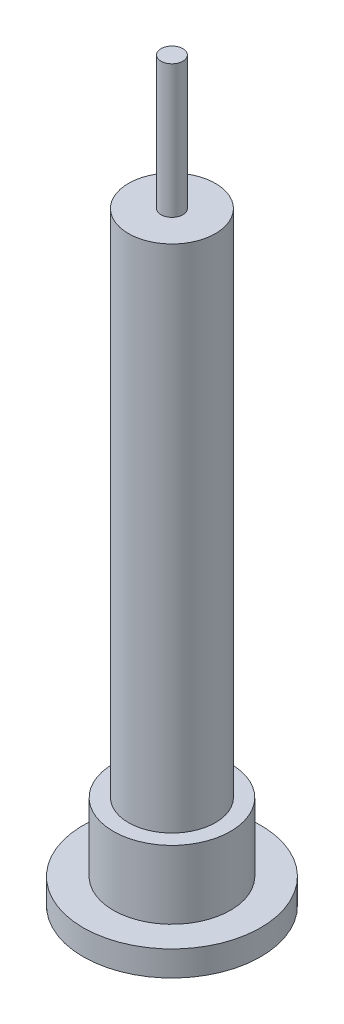
ISO-10303-21;
HEADER;
FILE_DESCRIPTION(('STEP AP214'),'2;1');
FILE_NAME('part.step','',(''),(''),'','','');
FILE_SCHEMA(('AUTOMOTIVE_DESIGN { 1 0 10303 214 1 1 1 1 }'));
ENDSEC;
DATA;
#1=APPLICATION_CONTEXT('core data for automotive mechanical design processes');
#2=APPLICATION_PROTOCOL_DEFINITION('international standard','automotive_design',2000,#1);
#3=PRODUCT_CONTEXT('',#1,'mechanical');
#4=PRODUCT('Part','Part','',(#3));
#5=PRODUCT_RELATED_PRODUCT_CATEGORY('part','',(#4));
#6=PRODUCT_DEFINITION_FORMATION('','',#4);
#7=PRODUCT_DEFINITION_CONTEXT('part definition',#1,'design');
#8=PRODUCT_DEFINITION('design','',#6,#7);
#9=PRODUCT_DEFINITION_SHAPE('','',#8);
#10=(LENGTH_UNIT() NAMED_UNIT(*) SI_UNIT(.MILLI.,.METRE.));
#11=(NAMED_UNIT(*) PLANE_ANGLE_UNIT() SI_UNIT($,.RADIAN.));
#12=(NAMED_UNIT(*) SI_UNIT($,.STERADIAN.) SOLID_ANGLE_UNIT());
#13=UNCERTAINTY_MEASURE_WITH_UNIT(LENGTH_MEASURE(1.E-05),#10,'distance_accuracy_value','');
#14=(GEOMETRIC_REPRESENTATION_CONTEXT(3) GLOBAL_UNCERTAINTY_ASSIGNED_CONTEXT((#13)) GLOBAL_UNIT_ASSIGNED_CONTEXT((#10,
#11,#12)) REPRESENTATION_CONTEXT('',''));
#15=CARTESIAN_POINT('',(0.,0.,0.));
#16=DIRECTION('',(0.,0.,1.));
#17=DIRECTION('',(1.,0.,0.));
#18=AXIS2_PLACEMENT_3D('',#15,#16,#17);
#19=CARTESIAN_POINT('',(0.,0.,0.));
#20=DIRECTION('',(0.,1.,0.));
#21=DIRECTION('',(0.,0.,1.));
#22=AXIS2_PLACEMENT_3D('',#19,#20,#21);
#23=PLANE('',#22);
#24=CARTESIAN_POINT('',(0.,0.,0.));
#25=DIRECTION('',(0.,1.,0.));
#26=DIRECTION('',(0.,0.,1.));
#27=AXIS2_PLACEMENT_3D('',#24,#25,#26);
#28=CIRCLE('',#27,3.);
#29=CARTESIAN_POINT('',(0.,0.,3.));
#30=VERTEX_POINT('',#29);
#31=EDGE_CURVE('E10',#30,#30,#28,.T.);
#32=ORIENTED_EDGE('',*,*,#31,.F.);
#33=EDGE_LOOP('',(#32));
#34=FACE_BOUND('',#33,.T.);
#35=ADVANCED_FACE('F36',(#34),#23,.F.);
#36=CARTESIAN_POINT('',(0.,84.9360278527402,0.));
#37=DIRECTION('',(0.,1.,0.));
#38=DIRECTION('',(0.,0.,1.));
#39=AXIS2_PLACEMENT_3D('',#36,#37,#38);
#40=CYLINDRICAL_SURFACE('',#39,3.);
#41=CARTESIAN_POINT('',(0.,1.93602785274018,0.));
#42=DIRECTION('',(0.,1.,0.));
#43=DIRECTION('',(0.,0.,1.));
#44=AXIS2_PLACEMENT_3D('',#41,#42,#43);
#45=CIRCLE('',#44,3.);
#46=CARTESIAN_POINT('',(0.,1.93602785274018,3.));
#47=VERTEX_POINT('',#46);
#48=EDGE_CURVE('E42',#47,#47,#45,.T.);
#49=ORIENTED_EDGE('',*,*,#48,.F.);
#50=EDGE_LOOP('',(#49));
#51=FACE_BOUND('',#50,.T.);
#52=ORIENTED_EDGE('',*,*,#31,.T.);
#53=EDGE_LOOP('',(#52));
#54=FACE_BOUND('',#53,.T.);
#55=ADVANCED_FACE('F120',(#51,#54),#40,.T.);
#56=CARTESIAN_POINT('',(3.,1.93602785274017,0.));
#57=DIRECTION('',(0.,1.,0.));
#58=DIRECTION('',(0.,0.,1.));
#59=AXIS2_PLACEMENT_3D('',#56,#57,#58);
#60=PLANE('',#59);
#61=CARTESIAN_POINT('',(0.,1.93602785274018,0.));
#62=DIRECTION('',(0.,1.,0.));
#63=DIRECTION('',(0.,0.,1.));
#64=AXIS2_PLACEMENT_3D('',#61,#62,#63);
#65=CIRCLE('',#64,10.);
#66=CARTESIAN_POINT('',(0.,1.93602785274018,10.));
#67=VERTEX_POINT('',#66);
#68=EDGE_CURVE('E46',#67,#67,#65,.T.);
#69=ORIENTED_EDGE('',*,*,#68,.F.);
#70=EDGE_LOOP('',(#69));
#71=FACE_BOUND('',#70,.T.);
#72=ORIENTED_EDGE('',*,*,#48,.T.);
#73=EDGE_LOOP('',(#72));
#74=FACE_BOUND('',#73,.T.);
#75=ADVANCED_FACE('F115',(#71,#74),#60,.F.);
#76=CARTESIAN_POINT('',(0.,84.9360278527402,0.));
#77=DIRECTION('',(0.,1.,0.));
#78=DIRECTION('',(0.,0.,1.));
#79=AXIS2_PLACEMENT_3D('',#76,#77,#78);
#80=CYLINDRICAL_SURFACE('',#79,10.);
#81=CARTESIAN_POINT('',(0.,4.77602785274017,0.));
#82=DIRECTION('',(0.,1.,0.));
#83=DIRECTION('',(0.,0.,1.));
#84=AXIS2_PLACEMENT_3D('',#81,#82,#83);
#85=CIRCLE('',#84,10.);
#86=CARTESIAN_POINT('',(0.,4.77602785274017,10.));
#87=VERTEX_POINT('',#86);
#88=EDGE_CURVE('E50',#87,#87,#85,.T.);
#89=ORIENTED_EDGE('',*,*,#88,.F.);
#90=EDGE_LOOP('',(#89));
#91=FACE_BOUND('',#90,.T.);
#92=ORIENTED_EDGE('',*,*,#68,.T.);
#93=EDGE_LOOP('',(#92));
#94=FACE_BOUND('',#93,.T.);
#95=ADVANCED_FACE('F109',(#91,#94),#80,.T.);
#96=CARTESIAN_POINT('',(10.,4.77602785274017,0.));
#97=DIRECTION('',(0.,-1.,0.));
#98=DIRECTION('',(0.,0.,-1.));
#99=AXIS2_PLACEMENT_3D('',#96,#97,#98);
#100=PLANE('',#99);
#101=CARTESIAN_POINT('',(0.,4.77602785274017,0.));
#102=DIRECTION('',(0.,1.,0.));
#103=DIRECTION('',(0.,0.,1.));
#104=AXIS2_PLACEMENT_3D('',#101,#102,#103);
#105=CIRCLE('',#104,6.6);
#106=CARTESIAN_POINT('',(0.,4.77602785274017,6.6));
#107=VERTEX_POINT('',#106);
#108=EDGE_CURVE('E55',#107,#107,#105,.T.);
#109=ORIENTED_EDGE('',*,*,#108,.F.);
#110=EDGE_LOOP('',(#109));
#111=FACE_BOUND('',#110,.T.);
#112=ORIENTED_EDGE('',*,*,#88,.T.);
#113=EDGE_LOOP('',(#112));
#114=FACE_BOUND('',#113,.T.);
#115=ADVANCED_FACE('F103',(#111,#114),#100,.F.);
#116=CARTESIAN_POINT('',(0.,84.9360278527402,0.));
#117=DIRECTION('',(0.,1.,0.));
#118=DIRECTION('',(0.,0.,1.));
#119=AXIS2_PLACEMENT_3D('',#116,#117,#118);
#120=CYLINDRICAL_SURFACE('',#119,6.6);
#121=CARTESIAN_POINT('',(0.,12.4760278527402,0.));
#122=DIRECTION('',(0.,1.,0.));
#123=DIRECTION('',(0.,0.,1.));
#124=AXIS2_PLACEMENT_3D('',#121,#122,#123);
#125=CIRCLE('',#124,6.6);
#126=CARTESIAN_POINT('',(0.,12.4760278527402,6.6));
#127=VERTEX_POINT('',#126);
#128=EDGE_CURVE('E58',#127,#127,#125,.T.);
#129=ORIENTED_EDGE('',*,*,#128,.F.);
#130=EDGE_LOOP('',(#129));
#131=FACE_BOUND('',#130,.T.);
#132=ORIENTED_EDGE('',*,*,#108,.T.);
#133=EDGE_LOOP('',(#132));
#134=FACE_BOUND('',#133,.T.);
#135=ADVANCED_FACE('F97',(#131,#134),#120,.T.);
#136=CARTESIAN_POINT('',(6.6,12.4760278527402,0.));
#137=DIRECTION('',(0.,-1.,0.));
#138=DIRECTION('',(0.,0.,-1.));
#139=AXIS2_PLACEMENT_3D('',#136,#137,#138);
#140=PLANE('',#139);
#141=CARTESIAN_POINT('',(0.,12.4760278527402,0.));
#142=DIRECTION('',(0.,1.,0.));
#143=DIRECTION('',(0.,0.,1.));
#144=AXIS2_PLACEMENT_3D('',#141,#142,#143);
#145=CIRCLE('',#144,4.90000000000001);
#146=CARTESIAN_POINT('',(0.,12.4760278527402,4.90000000000001));
#147=VERTEX_POINT('',#146);
#148=EDGE_CURVE('E61',#147,#147,#145,.T.);
#149=ORIENTED_EDGE('',*,*,#148,.F.);
#150=EDGE_LOOP('',(#149));
#151=FACE_BOUND('',#150,.T.);
#152=ORIENTED_EDGE('',*,*,#128,.T.);
#153=EDGE_LOOP('',(#152));
#154=FACE_BOUND('',#153,.T.);
#155=ADVANCED_FACE('F91',(#151,#154),#140,.F.);
#156=CARTESIAN_POINT('',(0.,84.9360278527402,0.));
#157=DIRECTION('',(0.,1.,0.));
#158=DIRECTION('',(0.,0.,1.));
#159=AXIS2_PLACEMENT_3D('',#156,#157,#158);
#160=CYLINDRICAL_SURFACE('',#159,4.90000000000001);
#161=CARTESIAN_POINT('',(0.,69.9524664485581,0.));
#162=DIRECTION('',(0.,1.,0.));
#163=DIRECTION('',(0.,0.,1.));
#164=AXIS2_PLACEMENT_3D('',#161,#162,#163);
#165=CIRCLE('',#164,4.90000000000001);
#166=CARTESIAN_POINT('',(0.,69.9524664485581,4.90000000000001));
#167=VERTEX_POINT('',#166);
#168=EDGE_CURVE('E64',#167,#167,#165,.T.);
#169=ORIENTED_EDGE('',*,*,#168,.F.);
#170=EDGE_LOOP('',(#169));
#171=FACE_BOUND('',#170,.T.);
#172=ORIENTED_EDGE('',*,*,#148,.T.);
#173=EDGE_LOOP('',(#172));
#174=FACE_BOUND('',#173,.T.);
#175=ADVANCED_FACE('F85',(#171,#174),#160,.T.);
#176=CARTESIAN_POINT('',(4.90000000000001,69.9524664485581,0.));
#177=DIRECTION('',(0.,-1.,0.));
#178=DIRECTION('',(0.,0.,-1.));
#179=AXIS2_PLACEMENT_3D('',#176,#177,#178);
#180=PLANE('',#179);
#181=CARTESIAN_POINT('',(0.,69.9524664485581,0.));
#182=DIRECTION('',(0.,1.,0.));
#183=DIRECTION('',(0.,0.,1.));
#184=AXIS2_PLACEMENT_3D('',#181,#182,#183);
#185=CIRCLE('',#184,1.22858664637339);
#186=CARTESIAN_POINT('',(0.,69.9524664485581,1.22858664637339));
#187=VERTEX_POINT('',#186);
#188=EDGE_CURVE('E67',#187,#187,#185,.T.);
#189=ORIENTED_EDGE('',*,*,#188,.F.);
#190=EDGE_LOOP('',(#189));
#191=FACE_BOUND('',#190,.T.);
#192=ORIENTED_EDGE('',*,*,#168,.T.);
#193=EDGE_LOOP('',(#192));
#194=FACE_BOUND('',#193,.T.);
#195=ADVANCED_FACE('F79',(#191,#194),#180,.F.);
#196=CARTESIAN_POINT('',(0.,84.9360278527402,0.));
#197=DIRECTION('',(0.,1.,0.));
#198=DIRECTION('',(0.,0.,1.));
#199=AXIS2_PLACEMENT_3D('',#196,#197,#198);
#200=CYLINDRICAL_SURFACE('',#199,1.22858664637339);
#201=CARTESIAN_POINT('',(0.,84.9360278527402,0.));
#202=DIRECTION('',(0.,1.,0.));
#203=DIRECTION('',(0.,0.,1.));
#204=AXIS2_PLACEMENT_3D('',#201,#202,#203);
#205=CIRCLE('',#204,1.22858664637339);
#206=CARTESIAN_POINT('',(0.,84.9360278527402,1.22858664637339));
#207=VERTEX_POINT('',#206);
#208=EDGE_CURVE('E70',#207,#207,#205,.T.);
#209=ORIENTED_EDGE('',*,*,#208,.F.);
#210=EDGE_LOOP('',(#209));
#211=FACE_BOUND('',#210,.T.);
#212=ORIENTED_EDGE('',*,*,#188,.T.);
#213=EDGE_LOOP('',(#212));
#214=FACE_BOUND('',#213,.T.);
#215=ADVANCED_FACE('F76',(#211,#214),#200,.T.);
#216=CARTESIAN_POINT('',(1.22858664637339,84.9360278527402,0.));
#217=DIRECTION('',(0.,-1.,0.));
#218=DIRECTION('',(0.,0.,-1.));
#219=AXIS2_PLACEMENT_3D('',#216,#217,#218);
#220=PLANE('',#219);
#221=ORIENTED_EDGE('',*,*,#208,.T.);
#222=EDGE_LOOP('',(#221));
#223=FACE_BOUND('',#222,.T.);
#224=ADVANCED_FACE('F74',(#223),#220,.F.);
#225=CLOSED_SHELL('',(#35,#55,#75,#95,#115,#135,#155,#175,#195,#215,#224));
#226=MANIFOLD_SOLID_BREP('B2',#225);
#227=ADVANCED_BREP_SHAPE_REPRESENTATION('',(#18,#226),#14);
#228=SHAPE_DEFINITION_REPRESENTATION(#9,#227);
ENDSEC;
END-ISO-10303-21;
